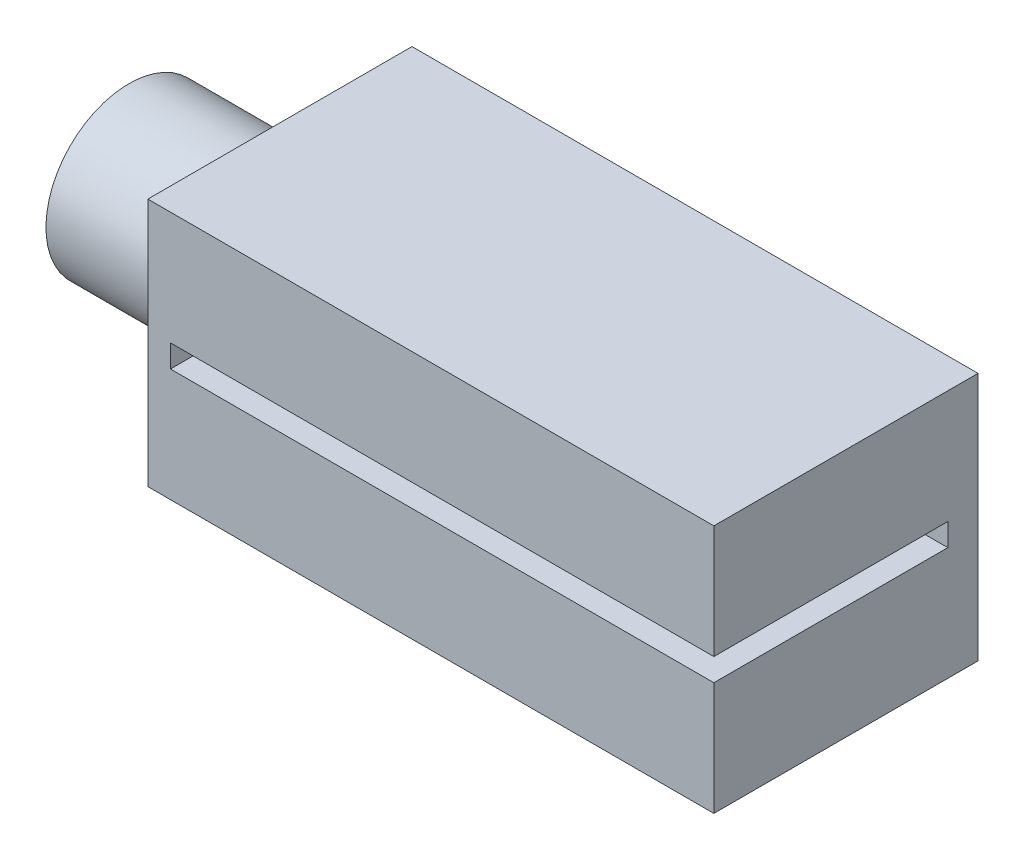
ISO-10303-21;
HEADER;
FILE_DESCRIPTION(('STEP AP214'),'2;1');
FILE_NAME('part.step','',(''),(''),'','','');
FILE_SCHEMA(('AUTOMOTIVE_DESIGN { 1 0 10303 214 1 1 1 1 }'));
ENDSEC;
DATA;
#1=APPLICATION_CONTEXT('core data for automotive mechanical design processes');
#2=APPLICATION_PROTOCOL_DEFINITION('international standard','automotive_design',2000,#1);
#3=PRODUCT_CONTEXT('',#1,'mechanical');
#4=PRODUCT('Part','Part','',(#3));
#5=PRODUCT_RELATED_PRODUCT_CATEGORY('part','',(#4));
#6=PRODUCT_DEFINITION_FORMATION('','',#4);
#7=PRODUCT_DEFINITION_CONTEXT('part definition',#1,'design');
#8=PRODUCT_DEFINITION('design','',#6,#7);
#9=PRODUCT_DEFINITION_SHAPE('','',#8);
#10=(LENGTH_UNIT() NAMED_UNIT(*) SI_UNIT(.MILLI.,.METRE.));
#11=(NAMED_UNIT(*) PLANE_ANGLE_UNIT() SI_UNIT($,.RADIAN.));
#12=(NAMED_UNIT(*) SI_UNIT($,.STERADIAN.) SOLID_ANGLE_UNIT());
#13=UNCERTAINTY_MEASURE_WITH_UNIT(LENGTH_MEASURE(1.E-05),#10,'distance_accuracy_value','');
#14=(GEOMETRIC_REPRESENTATION_CONTEXT(3) GLOBAL_UNCERTAINTY_ASSIGNED_CONTEXT((#13)) GLOBAL_UNIT_ASSIGNED_CONTEXT((#10,
#11,#12)) REPRESENTATION_CONTEXT('',''));
#15=CARTESIAN_POINT('',(0.,0.,0.));
#16=DIRECTION('',(0.,0.,1.));
#17=DIRECTION('',(1.,0.,0.));
#18=AXIS2_PLACEMENT_3D('',#15,#16,#17);
#19=CARTESIAN_POINT('',(0.,0.,-8.89));
#20=DIRECTION('',(-1.,0.,0.));
#21=DIRECTION('',(0.,0.,1.));
#22=AXIS2_PLACEMENT_3D('',#19,#20,#21);
#23=PLANE('',#22);
#24=DIRECTION('',(0.,-1.,0.));
#25=VECTOR('',#24,1.);
#26=CARTESIAN_POINT('',(0.,0.,0.));
#27=LINE('',#26,#25);
#28=CARTESIAN_POINT('',(0.,8.382,0.));
#29=VERTEX_POINT('',#28);
#30=CARTESIAN_POINT('',(0.,0.,0.));
#31=VERTEX_POINT('',#30);
#32=EDGE_CURVE('E142',#29,#31,#27,.T.);
#33=ORIENTED_EDGE('',*,*,#32,.F.);
#34=DIRECTION('',(0.,0.,1.));
#35=VECTOR('',#34,1.);
#36=CARTESIAN_POINT('',(0.,8.382,-8.89));
#37=LINE('',#36,#35);
#38=CARTESIAN_POINT('',(0.,8.382,-8.89));
#39=VERTEX_POINT('',#38);
#40=EDGE_CURVE('E11',#39,#29,#37,.T.);
#41=ORIENTED_EDGE('',*,*,#40,.F.);
#42=DIRECTION('',(0.,-1.,0.));
#43=VECTOR('',#42,1.);
#44=CARTESIAN_POINT('',(0.,0.,-8.89));
#45=LINE('',#44,#43);
#46=CARTESIAN_POINT('',(0.,0.,-8.89));
#47=VERTEX_POINT('',#46);
#48=EDGE_CURVE('E132',#39,#47,#45,.T.);
#49=ORIENTED_EDGE('',*,*,#48,.T.);
#50=DIRECTION('',(0.,0.,1.));
#51=VECTOR('',#50,1.);
#52=CARTESIAN_POINT('',(0.,0.,-8.89));
#53=LINE('',#52,#51);
#54=EDGE_CURVE('E35',#47,#31,#53,.T.);
#55=ORIENTED_EDGE('',*,*,#54,.T.);
#56=EDGE_LOOP('',(#33,#41,#49,#55));
#57=FACE_BOUND('',#56,.T.);
#58=CARTESIAN_POINT('',(0.,4.191,-4.445));
#59=DIRECTION('',(-1.,0.,0.));
#60=DIRECTION('',(0.,-1.,0.));
#61=AXIS2_PLACEMENT_3D('',#58,#59,#60);
#62=CIRCLE('',#61,2.794);
#63=CARTESIAN_POINT('',(0.,1.397,-4.445));
#64=VERTEX_POINT('',#63);
#65=EDGE_CURVE('E267',#64,#64,#62,.T.);
#66=ORIENTED_EDGE('',*,*,#65,.F.);
#67=EDGE_LOOP('',(#66));
#68=FACE_BOUND('',#67,.T.);
#69=ADVANCED_FACE('F32',(#57,#68),#23,.T.);
#70=CARTESIAN_POINT('',(0.,8.382,-8.89));
#71=DIRECTION('',(0.,1.,0.));
#72=DIRECTION('',(0.,0.,1.));
#73=AXIS2_PLACEMENT_3D('',#70,#71,#72);
#74=PLANE('',#73);
#75=DIRECTION('',(-1.,0.,0.));
#76=VECTOR('',#75,1.);
#77=CARTESIAN_POINT('',(0.,8.382,0.));
#78=LINE('',#77,#76);
#79=CARTESIAN_POINT('',(19.05,8.382,0.));
#80=VERTEX_POINT('',#79);
#81=EDGE_CURVE('E135',#80,#29,#78,.T.);
#82=ORIENTED_EDGE('',*,*,#81,.F.);
#83=DIRECTION('',(0.,0.,1.));
#84=VECTOR('',#83,1.);
#85=CARTESIAN_POINT('',(19.05,8.382,-8.89));
#86=LINE('',#85,#84);
#87=CARTESIAN_POINT('',(19.05,8.382,-8.89));
#88=VERTEX_POINT('',#87);
#89=EDGE_CURVE('E40',#88,#80,#86,.T.);
#90=ORIENTED_EDGE('',*,*,#89,.F.);
#91=DIRECTION('',(-1.,0.,0.));
#92=VECTOR('',#91,1.);
#93=CARTESIAN_POINT('',(0.,8.382,-8.89));
#94=LINE('',#93,#92);
#95=EDGE_CURVE('E140',#88,#39,#94,.T.);
#96=ORIENTED_EDGE('',*,*,#95,.T.);
#97=ORIENTED_EDGE('',*,*,#40,.T.);
#98=EDGE_LOOP('',(#82,#90,#96,#97));
#99=FACE_BOUND('',#98,.T.);
#100=ADVANCED_FACE('F160',(#99),#74,.T.);
#101=CARTESIAN_POINT('',(19.05,8.382,-8.89));
#102=DIRECTION('',(1.,0.,0.));
#103=DIRECTION('',(0.,0.,-1.));
#104=AXIS2_PLACEMENT_3D('',#101,#102,#103);
#105=PLANE('',#104);
#106=DIRECTION('',(0.,0.,1.));
#107=VECTOR('',#106,1.);
#108=CARTESIAN_POINT('',(19.05,3.81,-7.874));
#109=LINE('',#108,#107);
#110=CARTESIAN_POINT('',(19.05,3.81,-7.874));
#111=VERTEX_POINT('',#110);
#112=CARTESIAN_POINT('',(19.05,3.81,0.));
#113=VERTEX_POINT('',#112);
#114=EDGE_CURVE('E146',#111,#113,#109,.T.);
#115=ORIENTED_EDGE('',*,*,#114,.T.);
#116=DIRECTION('',(0.,1.,0.));
#117=VECTOR('',#116,1.);
#118=CARTESIAN_POINT('',(19.05,8.382,0.));
#119=LINE('',#118,#117);
#120=CARTESIAN_POINT('',(19.05,0.,0.));
#121=VERTEX_POINT('',#120);
#122=EDGE_CURVE('E149',#121,#113,#119,.T.);
#123=ORIENTED_EDGE('',*,*,#122,.F.);
#124=DIRECTION('',(0.,0.,1.));
#125=VECTOR('',#124,1.);
#126=CARTESIAN_POINT('',(19.05,0.,-8.89));
#127=LINE('',#126,#125);
#128=CARTESIAN_POINT('',(19.05,0.,-8.89));
#129=VERTEX_POINT('',#128);
#130=EDGE_CURVE('E154',#129,#121,#127,.T.);
#131=ORIENTED_EDGE('',*,*,#130,.F.);
#132=DIRECTION('',(0.,1.,0.));
#133=VECTOR('',#132,1.);
#134=CARTESIAN_POINT('',(19.05,8.382,-8.89));
#135=LINE('',#134,#133);
#136=EDGE_CURVE('E137',#129,#88,#135,.T.);
#137=ORIENTED_EDGE('',*,*,#136,.T.);
#138=ORIENTED_EDGE('',*,*,#89,.T.);
#139=CARTESIAN_POINT('',(19.05,4.572,0.));
#140=VERTEX_POINT('',#139);
#141=EDGE_CURVE('E125',#140,#80,#119,.T.);
#142=ORIENTED_EDGE('',*,*,#141,.F.);
#143=DIRECTION('',(0.,0.,1.));
#144=VECTOR('',#143,1.);
#145=CARTESIAN_POINT('',(19.05,4.572,-7.874));
#146=LINE('',#145,#144);
#147=CARTESIAN_POINT('',(19.05,4.572,-7.874));
#148=VERTEX_POINT('',#147);
#149=EDGE_CURVE('E48',#148,#140,#146,.T.);
#150=ORIENTED_EDGE('',*,*,#149,.F.);
#151=DIRECTION('',(0.,1.,0.));
#152=VECTOR('',#151,1.);
#153=CARTESIAN_POINT('',(19.05,3.81,-7.874));
#154=LINE('',#153,#152);
#155=EDGE_CURVE('E111',#111,#148,#154,.T.);
#156=ORIENTED_EDGE('',*,*,#155,.F.);
#157=EDGE_LOOP('',(#115,#123,#131,#137,#138,#142,#150,#156));
#158=FACE_BOUND('',#157,.T.);
#159=ADVANCED_FACE('F123',(#158),#105,.T.);
#160=CARTESIAN_POINT('',(0.,0.,-8.89));
#161=DIRECTION('',(0.,-1.,0.));
#162=DIRECTION('',(0.,0.,-1.));
#163=AXIS2_PLACEMENT_3D('',#160,#161,#162);
#164=PLANE('',#163);
#165=DIRECTION('',(1.,0.,0.));
#166=VECTOR('',#165,1.);
#167=CARTESIAN_POINT('',(0.,0.,0.));
#168=LINE('',#167,#166);
#169=EDGE_CURVE('E145',#31,#121,#168,.T.);
#170=ORIENTED_EDGE('',*,*,#169,.F.);
#171=ORIENTED_EDGE('',*,*,#54,.F.);
#172=DIRECTION('',(1.,0.,0.));
#173=VECTOR('',#172,1.);
#174=CARTESIAN_POINT('',(0.,0.,-8.89));
#175=LINE('',#174,#173);
#176=EDGE_CURVE('E134',#47,#129,#175,.T.);
#177=ORIENTED_EDGE('',*,*,#176,.T.);
#178=ORIENTED_EDGE('',*,*,#130,.T.);
#179=EDGE_LOOP('',(#170,#171,#177,#178));
#180=FACE_BOUND('',#179,.T.);
#181=ADVANCED_FACE('F157',(#180),#164,.T.);
#182=CARTESIAN_POINT('',(0.,8.382,-8.89));
#183=DIRECTION('',(0.,0.,-1.));
#184=DIRECTION('',(-1.,0.,0.));
#185=AXIS2_PLACEMENT_3D('',#182,#183,#184);
#186=PLANE('',#185);
#187=ORIENTED_EDGE('',*,*,#48,.F.);
#188=ORIENTED_EDGE('',*,*,#95,.F.);
#189=ORIENTED_EDGE('',*,*,#136,.F.);
#190=ORIENTED_EDGE('',*,*,#176,.F.);
#191=EDGE_LOOP('',(#187,#188,#189,#190));
#192=FACE_BOUND('',#191,.T.);
#193=ADVANCED_FACE('F164',(#192),#186,.T.);
#194=CARTESIAN_POINT('',(0.,8.382,0.));
#195=DIRECTION('',(0.,0.,-1.));
#196=DIRECTION('',(-1.,0.,0.));
#197=AXIS2_PLACEMENT_3D('',#194,#195,#196);
#198=PLANE('',#197);
#199=ORIENTED_EDGE('',*,*,#122,.T.);
#200=DIRECTION('',(1.,0.,0.));
#201=VECTOR('',#200,1.);
#202=CARTESIAN_POINT('',(0.762000000000002,3.81,0.));
#203=LINE('',#202,#201);
#204=CARTESIAN_POINT('',(0.762000000000002,3.81,0.));
#205=VERTEX_POINT('',#204);
#206=EDGE_CURVE('E120',#205,#113,#203,.T.);
#207=ORIENTED_EDGE('',*,*,#206,.F.);
#208=DIRECTION('',(0.,-1.,0.));
#209=VECTOR('',#208,1.);
#210=CARTESIAN_POINT('',(0.762000000000002,3.81,0.));
#211=LINE('',#210,#209);
#212=CARTESIAN_POINT('',(0.762000000000002,4.572,0.));
#213=VERTEX_POINT('',#212);
#214=EDGE_CURVE('E269',#213,#205,#211,.T.);
#215=ORIENTED_EDGE('',*,*,#214,.F.);
#216=DIRECTION('',(-1.,0.,0.));
#217=VECTOR('',#216,1.);
#218=CARTESIAN_POINT('',(0.762000000000002,4.572,0.));
#219=LINE('',#218,#217);
#220=EDGE_CURVE('E266',#140,#213,#219,.T.);
#221=ORIENTED_EDGE('',*,*,#220,.F.);
#222=ORIENTED_EDGE('',*,*,#141,.T.);
#223=ORIENTED_EDGE('',*,*,#81,.T.);
#224=ORIENTED_EDGE('',*,*,#32,.T.);
#225=ORIENTED_EDGE('',*,*,#169,.T.);
#226=EDGE_LOOP('',(#199,#207,#215,#221,#222,#223,#224,#225));
#227=FACE_BOUND('',#226,.T.);
#228=ADVANCED_FACE('F159',(#227),#198,.F.);
#229=CARTESIAN_POINT('',(0.762000000000002,3.81,-7.874));
#230=DIRECTION('',(0.,-1.,0.));
#231=DIRECTION('',(0.,0.,-1.));
#232=AXIS2_PLACEMENT_3D('',#229,#230,#231);
#233=PLANE('',#232);
#234=ORIENTED_EDGE('',*,*,#206,.T.);
#235=ORIENTED_EDGE('',*,*,#114,.F.);
#236=DIRECTION('',(1.,0.,0.));
#237=VECTOR('',#236,1.);
#238=CARTESIAN_POINT('',(0.762000000000002,3.81,-7.874));
#239=LINE('',#238,#237);
#240=CARTESIAN_POINT('',(0.762000000000002,3.81,-7.874));
#241=VERTEX_POINT('',#240);
#242=EDGE_CURVE('E117',#241,#111,#239,.T.);
#243=ORIENTED_EDGE('',*,*,#242,.F.);
#244=DIRECTION('',(0.,0.,1.));
#245=VECTOR('',#244,1.);
#246=CARTESIAN_POINT('',(0.762000000000002,3.81,-7.874));
#247=LINE('',#246,#245);
#248=EDGE_CURVE('E127',#241,#205,#247,.T.);
#249=ORIENTED_EDGE('',*,*,#248,.T.);
#250=EDGE_LOOP('',(#234,#235,#243,#249));
#251=FACE_BOUND('',#250,.T.);
#252=ADVANCED_FACE('F171',(#251),#233,.F.);
#253=CARTESIAN_POINT('',(0.762000000000002,3.81,-7.874));
#254=DIRECTION('',(-1.,0.,0.));
#255=DIRECTION('',(0.,0.,1.));
#256=AXIS2_PLACEMENT_3D('',#253,#254,#255);
#257=PLANE('',#256);
#258=ORIENTED_EDGE('',*,*,#214,.T.);
#259=ORIENTED_EDGE('',*,*,#248,.F.);
#260=DIRECTION('',(0.,-1.,0.));
#261=VECTOR('',#260,1.);
#262=CARTESIAN_POINT('',(0.762000000000002,3.81,-7.874));
#263=LINE('',#262,#261);
#264=CARTESIAN_POINT('',(0.762000000000002,4.572,-7.874));
#265=VERTEX_POINT('',#264);
#266=EDGE_CURVE('E110',#265,#241,#263,.T.);
#267=ORIENTED_EDGE('',*,*,#266,.F.);
#268=DIRECTION('',(0.,0.,1.));
#269=VECTOR('',#268,1.);
#270=CARTESIAN_POINT('',(0.762000000000002,4.572,-7.874));
#271=LINE('',#270,#269);
#272=EDGE_CURVE('E106',#265,#213,#271,.T.);
#273=ORIENTED_EDGE('',*,*,#272,.T.);
#274=EDGE_LOOP('',(#258,#259,#267,#273));
#275=FACE_BOUND('',#274,.T.);
#276=ADVANCED_FACE('F210',(#275),#257,.F.);
#277=CARTESIAN_POINT('',(0.762000000000002,4.572,-7.874));
#278=DIRECTION('',(0.,1.,0.));
#279=DIRECTION('',(0.,0.,1.));
#280=AXIS2_PLACEMENT_3D('',#277,#278,#279);
#281=PLANE('',#280);
#282=ORIENTED_EDGE('',*,*,#220,.T.);
#283=ORIENTED_EDGE('',*,*,#272,.F.);
#284=DIRECTION('',(-1.,0.,0.));
#285=VECTOR('',#284,1.);
#286=CARTESIAN_POINT('',(0.762000000000002,4.572,-7.874));
#287=LINE('',#286,#285);
#288=EDGE_CURVE('E103',#148,#265,#287,.T.);
#289=ORIENTED_EDGE('',*,*,#288,.F.);
#290=ORIENTED_EDGE('',*,*,#149,.T.);
#291=EDGE_LOOP('',(#282,#283,#289,#290));
#292=FACE_BOUND('',#291,.T.);
#293=ADVANCED_FACE('F105',(#292),#281,.F.);
#294=CARTESIAN_POINT('',(19.05,4.572,-7.874));
#295=DIRECTION('',(0.,0.,-1.));
#296=DIRECTION('',(-1.,0.,0.));
#297=AXIS2_PLACEMENT_3D('',#294,#295,#296);
#298=PLANE('',#297);
#299=ORIENTED_EDGE('',*,*,#155,.T.);
#300=ORIENTED_EDGE('',*,*,#288,.T.);
#301=ORIENTED_EDGE('',*,*,#266,.T.);
#302=ORIENTED_EDGE('',*,*,#242,.T.);
#303=EDGE_LOOP('',(#299,#300,#301,#302));
#304=FACE_BOUND('',#303,.T.);
#305=ADVANCED_FACE('F115',(#304),#298,.F.);
#306=CARTESIAN_POINT('',(-5.08,4.191,-4.445));
#307=DIRECTION('',(1.,0.,0.));
#308=DIRECTION('',(0.,1.,0.));
#309=AXIS2_PLACEMENT_3D('',#306,#307,#308);
#310=CYLINDRICAL_SURFACE('',#309,2.794);
#311=CARTESIAN_POINT('',(-5.08,4.191,-4.445));
#312=DIRECTION('',(-1.,0.,0.));
#313=DIRECTION('',(0.,-1.,0.));
#314=AXIS2_PLACEMENT_3D('',#311,#312,#313);
#315=CIRCLE('',#314,2.794);
#316=CARTESIAN_POINT('',(-5.08,1.397,-4.445));
#317=VERTEX_POINT('',#316);
#318=EDGE_CURVE('E265',#317,#317,#315,.T.);
#319=ORIENTED_EDGE('',*,*,#318,.F.);
#320=EDGE_LOOP('',(#319));
#321=FACE_BOUND('',#320,.T.);
#322=ORIENTED_EDGE('',*,*,#65,.T.);
#323=EDGE_LOOP('',(#322));
#324=FACE_BOUND('',#323,.T.);
#325=ADVANCED_FACE('F233',(#321,#324),#310,.T.);
#326=CARTESIAN_POINT('',(-5.08,4.191,-4.445));
#327=DIRECTION('',(-1.,0.,0.));
#328=DIRECTION('',(0.,-1.,0.));
#329=AXIS2_PLACEMENT_3D('',#326,#327,#328);
#330=PLANE('',#329);
#331=ORIENTED_EDGE('',*,*,#318,.T.);
#332=EDGE_LOOP('',(#331));
#333=FACE_BOUND('',#332,.T.);
#334=ADVANCED_FACE('F245',(#333),#330,.T.);
#335=CLOSED_SHELL('',(#69,#100,#159,#181,#193,#228,#252,#276,#293,#305,#325,#334));
#336=MANIFOLD_SOLID_BREP('B2',#335);
#337=ADVANCED_BREP_SHAPE_REPRESENTATION('',(#18,#336),#14);
#338=SHAPE_DEFINITION_REPRESENTATION(#9,#337);
ENDSEC;
END-ISO-10303-21;
